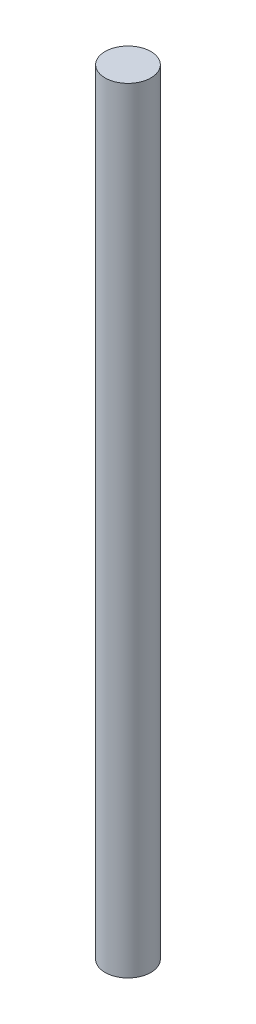
ISO-10303-21;
HEADER;
FILE_DESCRIPTION(('STEP AP214'),'2;1');
FILE_NAME('part.step','',(''),(''),'','','');
FILE_SCHEMA(('AUTOMOTIVE_DESIGN { 1 0 10303 214 1 1 1 1 }'));
ENDSEC;
DATA;
#1=APPLICATION_CONTEXT('core data for automotive mechanical design processes');
#2=APPLICATION_PROTOCOL_DEFINITION('international standard','automotive_design',2000,#1);
#3=PRODUCT_CONTEXT('',#1,'mechanical');
#4=PRODUCT('Part','Part','',(#3));
#5=PRODUCT_RELATED_PRODUCT_CATEGORY('part','',(#4));
#6=PRODUCT_DEFINITION_FORMATION('','',#4);
#7=PRODUCT_DEFINITION_CONTEXT('part definition',#1,'design');
#8=PRODUCT_DEFINITION('design','',#6,#7);
#9=PRODUCT_DEFINITION_SHAPE('','',#8);
#10=(LENGTH_UNIT() NAMED_UNIT(*) SI_UNIT(.MILLI.,.METRE.));
#11=(NAMED_UNIT(*) PLANE_ANGLE_UNIT() SI_UNIT($,.RADIAN.));
#12=(NAMED_UNIT(*) SI_UNIT($,.STERADIAN.) SOLID_ANGLE_UNIT());
#13=UNCERTAINTY_MEASURE_WITH_UNIT(LENGTH_MEASURE(1.E-05),#10,'distance_accuracy_value','');
#14=(GEOMETRIC_REPRESENTATION_CONTEXT(3) GLOBAL_UNCERTAINTY_ASSIGNED_CONTEXT((#13)) GLOBAL_UNIT_ASSIGNED_CONTEXT((#10,
#11,#12)) REPRESENTATION_CONTEXT('',''));
#15=CARTESIAN_POINT('',(0.,0.,0.));
#16=DIRECTION('',(0.,0.,1.));
#17=DIRECTION('',(1.,0.,0.));
#18=AXIS2_PLACEMENT_3D('',#15,#16,#17);
#19=CARTESIAN_POINT('',(0.,203.,0.));
#20=DIRECTION('',(0.,-1.,0.));
#21=DIRECTION('',(0.,0.,-1.));
#22=AXIS2_PLACEMENT_3D('',#19,#20,#21);
#23=CYLINDRICAL_SURFACE('',#22,6.);
#24=CARTESIAN_POINT('',(0.,203.,0.));
#25=DIRECTION('',(0.,1.,0.));
#26=DIRECTION('',(0.,0.,1.));
#27=AXIS2_PLACEMENT_3D('',#24,#25,#26);
#28=CIRCLE('',#27,6.);
#29=CARTESIAN_POINT('',(0.,203.,6.));
#30=VERTEX_POINT('',#29);
#31=EDGE_CURVE('E10',#30,#30,#28,.T.);
#32=ORIENTED_EDGE('',*,*,#31,.F.);
#33=EDGE_LOOP('',(#32));
#34=FACE_BOUND('',#33,.T.);
#35=CARTESIAN_POINT('',(0.,0.,0.));
#36=DIRECTION('',(0.,1.,0.));
#37=DIRECTION('',(0.,0.,1.));
#38=AXIS2_PLACEMENT_3D('',#35,#36,#37);
#39=CIRCLE('',#38,6.);
#40=CARTESIAN_POINT('',(0.,0.,6.));
#41=VERTEX_POINT('',#40);
#42=EDGE_CURVE('E18',#41,#41,#39,.T.);
#43=ORIENTED_EDGE('',*,*,#42,.T.);
#44=EDGE_LOOP('',(#43));
#45=FACE_BOUND('',#44,.T.);
#46=ADVANCED_FACE('F15',(#34,#45),#23,.T.);
#47=CARTESIAN_POINT('',(0.,203.,0.));
#48=DIRECTION('',(0.,1.,0.));
#49=DIRECTION('',(0.,0.,1.));
#50=AXIS2_PLACEMENT_3D('',#47,#48,#49);
#51=PLANE('',#50);
#52=ORIENTED_EDGE('',*,*,#31,.T.);
#53=EDGE_LOOP('',(#52));
#54=FACE_BOUND('',#53,.T.);
#55=ADVANCED_FACE('F30',(#54),#51,.T.);
#56=CARTESIAN_POINT('',(0.,0.,0.));
#57=DIRECTION('',(0.,1.,0.));
#58=DIRECTION('',(0.,0.,1.));
#59=AXIS2_PLACEMENT_3D('',#56,#57,#58);
#60=PLANE('',#59);
#61=ORIENTED_EDGE('',*,*,#42,.F.);
#62=EDGE_LOOP('',(#61));
#63=FACE_BOUND('',#62,.T.);
#64=ADVANCED_FACE('F28',(#63),#60,.F.);
#65=CLOSED_SHELL('',(#46,#55,#64));
#66=MANIFOLD_SOLID_BREP('B1',#65);
#67=ADVANCED_BREP_SHAPE_REPRESENTATION('',(#18,#66),#14);
#68=SHAPE_DEFINITION_REPRESENTATION(#9,#67);
ENDSEC;
END-ISO-10303-21;
